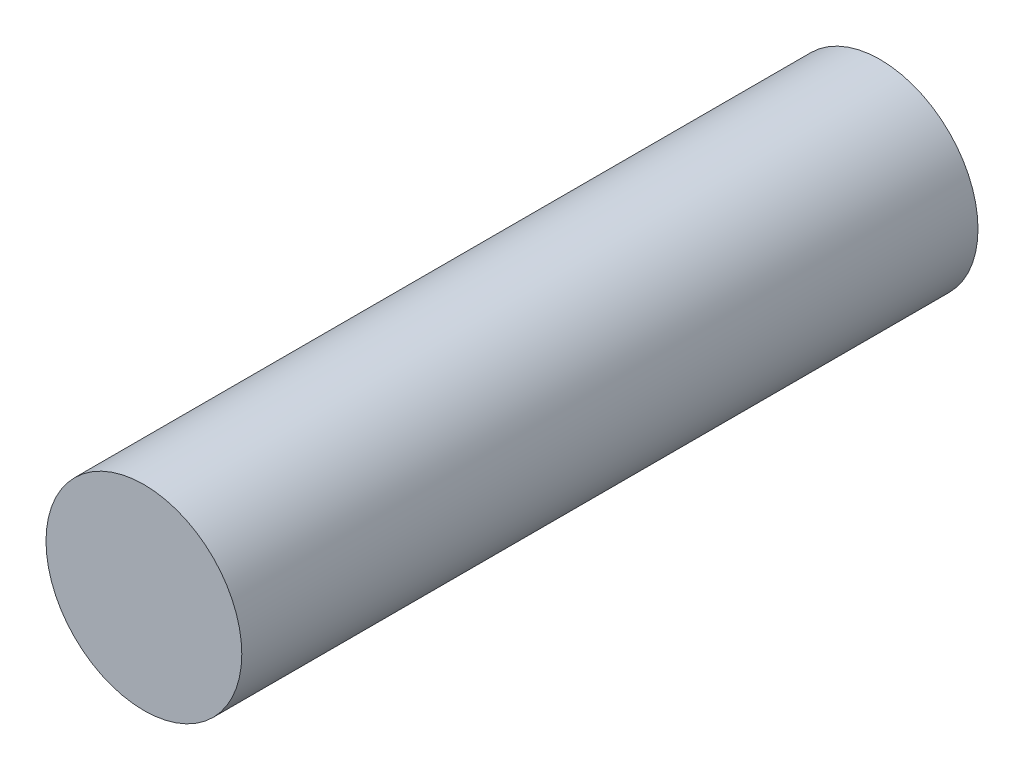
ISO-10303-21;
HEADER;
FILE_DESCRIPTION(('STEP AP214'),'2;1');
FILE_NAME('part.step','',(''),(''),'','','');
FILE_SCHEMA(('AUTOMOTIVE_DESIGN { 1 0 10303 214 1 1 1 1 }'));
ENDSEC;
DATA;
#1=APPLICATION_CONTEXT('core data for automotive mechanical design processes');
#2=APPLICATION_PROTOCOL_DEFINITION('international standard','automotive_design',2000,#1);
#3=PRODUCT_CONTEXT('',#1,'mechanical');
#4=PRODUCT('Part','Part','',(#3));
#5=PRODUCT_RELATED_PRODUCT_CATEGORY('part','',(#4));
#6=PRODUCT_DEFINITION_FORMATION('','',#4);
#7=PRODUCT_DEFINITION_CONTEXT('part definition',#1,'design');
#8=PRODUCT_DEFINITION('design','',#6,#7);
#9=PRODUCT_DEFINITION_SHAPE('','',#8);
#10=(LENGTH_UNIT() NAMED_UNIT(*) SI_UNIT(.MILLI.,.METRE.));
#11=(NAMED_UNIT(*) PLANE_ANGLE_UNIT() SI_UNIT($,.RADIAN.));
#12=(NAMED_UNIT(*) SI_UNIT($,.STERADIAN.) SOLID_ANGLE_UNIT());
#13=UNCERTAINTY_MEASURE_WITH_UNIT(LENGTH_MEASURE(1.E-05),#10,'distance_accuracy_value','');
#14=(GEOMETRIC_REPRESENTATION_CONTEXT(3) GLOBAL_UNCERTAINTY_ASSIGNED_CONTEXT((#13)) GLOBAL_UNIT_ASSIGNED_CONTEXT((#10,
#11,#12)) REPRESENTATION_CONTEXT('',''));
#15=CARTESIAN_POINT('',(0.,0.,0.));
#16=DIRECTION('',(0.,0.,1.));
#17=DIRECTION('',(1.,0.,0.));
#18=AXIS2_PLACEMENT_3D('',#15,#16,#17);
#19=CARTESIAN_POINT('',(0.,0.,48.28));
#20=DIRECTION('',(0.,0.,-1.));
#21=DIRECTION('',(-1.,0.,0.));
#22=AXIS2_PLACEMENT_3D('',#19,#20,#21);
#23=CYLINDRICAL_SURFACE('',#22,6.42);
#24=CARTESIAN_POINT('',(0.,0.,48.28));
#25=DIRECTION('',(0.,0.,1.));
#26=DIRECTION('',(1.,0.,0.));
#27=AXIS2_PLACEMENT_3D('',#24,#25,#26);
#28=CIRCLE('',#27,6.42);
#29=CARTESIAN_POINT('',(6.42,0.,48.28));
#30=VERTEX_POINT('',#29);
#31=EDGE_CURVE('E10',#30,#30,#28,.T.);
#32=ORIENTED_EDGE('',*,*,#31,.F.);
#33=EDGE_LOOP('',(#32));
#34=FACE_BOUND('',#33,.T.);
#35=CARTESIAN_POINT('',(0.,0.,0.));
#36=DIRECTION('',(0.,0.,1.));
#37=DIRECTION('',(1.,0.,0.));
#38=AXIS2_PLACEMENT_3D('',#35,#36,#37);
#39=CIRCLE('',#38,6.42);
#40=CARTESIAN_POINT('',(6.42,0.,0.));
#41=VERTEX_POINT('',#40);
#42=EDGE_CURVE('E46',#41,#41,#39,.T.);
#43=ORIENTED_EDGE('',*,*,#42,.T.);
#44=EDGE_LOOP('',(#43));
#45=FACE_BOUND('',#44,.T.);
#46=ADVANCED_FACE('F43',(#34,#45),#23,.T.);
#47=CARTESIAN_POINT('',(0.,0.,48.28));
#48=DIRECTION('',(0.,0.,1.));
#49=DIRECTION('',(1.,0.,0.));
#50=AXIS2_PLACEMENT_3D('',#47,#48,#49);
#51=PLANE('',#50);
#52=ORIENTED_EDGE('',*,*,#31,.T.);
#53=EDGE_LOOP('',(#52));
#54=FACE_BOUND('',#53,.T.);
#55=ADVANCED_FACE('F60',(#54),#51,.T.);
#56=CARTESIAN_POINT('',(0.,0.,0.));
#57=DIRECTION('',(0.,0.,1.));
#58=DIRECTION('',(1.,0.,0.));
#59=AXIS2_PLACEMENT_3D('',#56,#57,#58);
#60=PLANE('',#59);
#61=ORIENTED_EDGE('',*,*,#42,.F.);
#62=EDGE_LOOP('',(#61));
#63=FACE_BOUND('',#62,.T.);
#64=ADVANCED_FACE('F58',(#63),#60,.F.);
#65=CLOSED_SHELL('',(#46,#55,#64));
#66=MANIFOLD_SOLID_BREP('B2',#65);
#67=ADVANCED_BREP_SHAPE_REPRESENTATION('',(#18,#66),#14);
#68=SHAPE_DEFINITION_REPRESENTATION(#9,#67);
ENDSEC;
END-ISO-10303-21;
